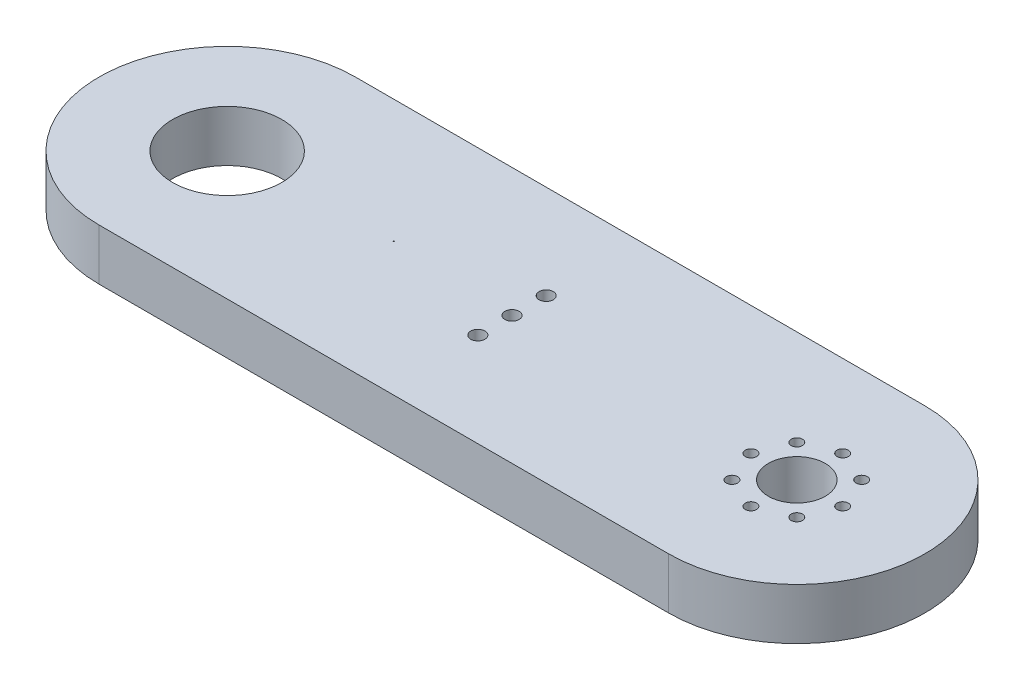
ISO-10303-21;
HEADER;
FILE_DESCRIPTION(('STEP AP214'),'2;1');
FILE_NAME('part.step','',(''),(''),'','','');
FILE_SCHEMA(('AUTOMOTIVE_DESIGN { 1 0 10303 214 1 1 1 1 }'));
ENDSEC;
DATA;
#1=APPLICATION_CONTEXT('core data for automotive mechanical design processes');
#2=APPLICATION_PROTOCOL_DEFINITION('international standard','automotive_design',2000,#1);
#3=PRODUCT_CONTEXT('',#1,'mechanical');
#4=PRODUCT('Part','Part','',(#3));
#5=PRODUCT_RELATED_PRODUCT_CATEGORY('part','',(#4));
#6=PRODUCT_DEFINITION_FORMATION('','',#4);
#7=PRODUCT_DEFINITION_CONTEXT('part definition',#1,'design');
#8=PRODUCT_DEFINITION('design','',#6,#7);
#9=PRODUCT_DEFINITION_SHAPE('','',#8);
#10=(LENGTH_UNIT() NAMED_UNIT(*) SI_UNIT(.MILLI.,.METRE.));
#11=(NAMED_UNIT(*) PLANE_ANGLE_UNIT() SI_UNIT($,.RADIAN.));
#12=(NAMED_UNIT(*) SI_UNIT($,.STERADIAN.) SOLID_ANGLE_UNIT());
#13=UNCERTAINTY_MEASURE_WITH_UNIT(LENGTH_MEASURE(1.E-05),#10,'distance_accuracy_value','');
#14=(GEOMETRIC_REPRESENTATION_CONTEXT(3) GLOBAL_UNCERTAINTY_ASSIGNED_CONTEXT((#13)) GLOBAL_UNIT_ASSIGNED_CONTEXT((#10,
#11,#12)) REPRESENTATION_CONTEXT('',''));
#15=CARTESIAN_POINT('',(0.,0.,0.));
#16=DIRECTION('',(0.,0.,1.));
#17=DIRECTION('',(1.,0.,0.));
#18=AXIS2_PLACEMENT_3D('',#15,#16,#17);
#19=CARTESIAN_POINT('',(50.,4.5,0.));
#20=DIRECTION('',(0.,-1.,0.));
#21=DIRECTION('',(0.,0.,-1.));
#22=AXIS2_PLACEMENT_3D('',#19,#20,#21);
#23=CYLINDRICAL_SURFACE('',#22,22.5);
#24=CARTESIAN_POINT('',(50.,-4.5,0.));
#25=DIRECTION('',(0.,1.,0.));
#26=DIRECTION('',(0.,0.,1.));
#27=AXIS2_PLACEMENT_3D('',#24,#25,#26);
#28=CIRCLE('',#27,22.5);
#29=CARTESIAN_POINT('',(50.,-4.5,22.5));
#30=VERTEX_POINT('',#29);
#31=CARTESIAN_POINT('',(50.,-4.5,-22.5));
#32=VERTEX_POINT('',#31);
#33=EDGE_CURVE('E107',#30,#32,#28,.T.);
#34=ORIENTED_EDGE('',*,*,#33,.T.);
#35=DIRECTION('',(0.,-1.,0.));
#36=VECTOR('',#35,1.);
#37=CARTESIAN_POINT('',(50.,4.5,-22.5));
#38=LINE('',#37,#36);
#39=CARTESIAN_POINT('',(50.,4.5,-22.5));
#40=VERTEX_POINT('',#39);
#41=EDGE_CURVE('E11',#40,#32,#38,.T.);
#42=ORIENTED_EDGE('',*,*,#41,.F.);
#43=CARTESIAN_POINT('',(50.,4.5,0.));
#44=DIRECTION('',(0.,1.,0.));
#45=DIRECTION('',(0.,0.,1.));
#46=AXIS2_PLACEMENT_3D('',#43,#44,#45);
#47=CIRCLE('',#46,22.5);
#48=CARTESIAN_POINT('',(50.,4.5,22.5));
#49=VERTEX_POINT('',#48);
#50=EDGE_CURVE('E91',#49,#40,#47,.T.);
#51=ORIENTED_EDGE('',*,*,#50,.F.);
#52=DIRECTION('',(0.,-1.,0.));
#53=VECTOR('',#52,1.);
#54=CARTESIAN_POINT('',(50.,4.5,22.5));
#55=LINE('',#54,#53);
#56=EDGE_CURVE('E103',#49,#30,#55,.T.);
#57=ORIENTED_EDGE('',*,*,#56,.T.);
#58=EDGE_LOOP('',(#34,#42,#51,#57));
#59=FACE_BOUND('',#58,.T.);
#60=ADVANCED_FACE('F39',(#59),#23,.T.);
#61=CARTESIAN_POINT('',(50.,4.5,-22.5));
#62=DIRECTION('',(0.,0.,1.));
#63=DIRECTION('',(1.,0.,0.));
#64=AXIS2_PLACEMENT_3D('',#61,#62,#63);
#65=PLANE('',#64);
#66=DIRECTION('',(-1.,0.,0.));
#67=VECTOR('',#66,1.);
#68=CARTESIAN_POINT('',(50.,-4.5,-22.5));
#69=LINE('',#68,#67);
#70=CARTESIAN_POINT('',(-50.,-4.5,-22.5));
#71=VERTEX_POINT('',#70);
#72=EDGE_CURVE('E96',#32,#71,#69,.T.);
#73=ORIENTED_EDGE('',*,*,#72,.T.);
#74=DIRECTION('',(0.,-1.,0.));
#75=VECTOR('',#74,1.);
#76=CARTESIAN_POINT('',(-50.,4.5,-22.5));
#77=LINE('',#76,#75);
#78=CARTESIAN_POINT('',(-50.,4.5,-22.5));
#79=VERTEX_POINT('',#78);
#80=EDGE_CURVE('E48',#79,#71,#77,.T.);
#81=ORIENTED_EDGE('',*,*,#80,.F.);
#82=DIRECTION('',(-1.,0.,0.));
#83=VECTOR('',#82,1.);
#84=CARTESIAN_POINT('',(50.,4.5,-22.5));
#85=LINE('',#84,#83);
#86=EDGE_CURVE('E86',#40,#79,#85,.T.);
#87=ORIENTED_EDGE('',*,*,#86,.F.);
#88=ORIENTED_EDGE('',*,*,#41,.T.);
#89=EDGE_LOOP('',(#73,#81,#87,#88));
#90=FACE_BOUND('',#89,.T.);
#91=ADVANCED_FACE('F95',(#90),#65,.F.);
#92=CARTESIAN_POINT('',(-50.,4.5,0.));
#93=DIRECTION('',(0.,-1.,0.));
#94=DIRECTION('',(0.,0.,-1.));
#95=AXIS2_PLACEMENT_3D('',#92,#93,#94);
#96=CYLINDRICAL_SURFACE('',#95,22.5);
#97=CARTESIAN_POINT('',(-50.,-4.5,0.));
#98=DIRECTION('',(0.,1.,0.));
#99=DIRECTION('',(0.,0.,1.));
#100=AXIS2_PLACEMENT_3D('',#97,#98,#99);
#101=CIRCLE('',#100,22.5);
#102=CARTESIAN_POINT('',(-50.,-4.5,22.5));
#103=VERTEX_POINT('',#102);
#104=EDGE_CURVE('E73',#71,#103,#101,.T.);
#105=ORIENTED_EDGE('',*,*,#104,.T.);
#106=DIRECTION('',(0.,-1.,0.));
#107=VECTOR('',#106,1.);
#108=CARTESIAN_POINT('',(-50.,4.5,22.5));
#109=LINE('',#108,#107);
#110=CARTESIAN_POINT('',(-50.,4.5,22.5));
#111=VERTEX_POINT('',#110);
#112=EDGE_CURVE('E98',#111,#103,#109,.T.);
#113=ORIENTED_EDGE('',*,*,#112,.F.);
#114=CARTESIAN_POINT('',(-50.,4.5,0.));
#115=DIRECTION('',(0.,1.,0.));
#116=DIRECTION('',(0.,0.,1.));
#117=AXIS2_PLACEMENT_3D('',#114,#115,#116);
#118=CIRCLE('',#117,22.5);
#119=EDGE_CURVE('E89',#79,#111,#118,.T.);
#120=ORIENTED_EDGE('',*,*,#119,.F.);
#121=ORIENTED_EDGE('',*,*,#80,.T.);
#122=EDGE_LOOP('',(#105,#113,#120,#121));
#123=FACE_BOUND('',#122,.T.);
#124=ADVANCED_FACE('F99',(#123),#96,.T.);
#125=CARTESIAN_POINT('',(50.,4.5,22.5));
#126=DIRECTION('',(0.,0.,-1.));
#127=DIRECTION('',(-1.,0.,0.));
#128=AXIS2_PLACEMENT_3D('',#125,#126,#127);
#129=PLANE('',#128);
#130=DIRECTION('',(1.,0.,0.));
#131=VECTOR('',#130,1.);
#132=CARTESIAN_POINT('',(50.,-4.5,22.5));
#133=LINE('',#132,#131);
#134=EDGE_CURVE('E79',#103,#30,#133,.T.);
#135=ORIENTED_EDGE('',*,*,#134,.T.);
#136=ORIENTED_EDGE('',*,*,#56,.F.);
#137=DIRECTION('',(1.,0.,0.));
#138=VECTOR('',#137,1.);
#139=CARTESIAN_POINT('',(50.,4.5,22.5));
#140=LINE('',#139,#138);
#141=EDGE_CURVE('E56',#111,#49,#140,.T.);
#142=ORIENTED_EDGE('',*,*,#141,.F.);
#143=ORIENTED_EDGE('',*,*,#112,.T.);
#144=EDGE_LOOP('',(#135,#136,#142,#143));
#145=FACE_BOUND('',#144,.T.);
#146=ADVANCED_FACE('F121',(#145),#129,.F.);
#147=CARTESIAN_POINT('',(50.,4.5,0.));
#148=DIRECTION('',(0.,1.,0.));
#149=DIRECTION('',(0.,0.,1.));
#150=AXIS2_PLACEMENT_3D('',#147,#148,#149);
#151=PLANE('',#150);
#152=CARTESIAN_POINT('',(-21.6659429639133,4.5,-0.906896610734044));
#153=DIRECTION('',(0.,-1.,0.));
#154=DIRECTION('',(0.,0.,-1.));
#155=AXIS2_PLACEMENT_3D('',#152,#153,#154);
#156=CIRCLE('',#155,0.0749299999999974);
#157=CARTESIAN_POINT('',(-21.6659429639133,4.5,-0.981826610734041));
#158=VERTEX_POINT('',#157);
#159=EDGE_CURVE('E231',#158,#158,#156,.T.);
#160=ORIENTED_EDGE('',*,*,#159,.T.);
#161=EDGE_LOOP('',(#160));
#162=FACE_BOUND('',#161,.T.);
#163=CARTESIAN_POINT('',(-50.,4.5,0.));
#164=DIRECTION('',(0.,1.,0.));
#165=DIRECTION('',(0.,0.,1.));
#166=AXIS2_PLACEMENT_3D('',#163,#164,#165);
#167=CIRCLE('',#166,9.59179886556777);
#168=CARTESIAN_POINT('',(-50.,4.5,9.59179886556778));
#169=VERTEX_POINT('',#168);
#170=EDGE_CURVE('E217',#169,#169,#167,.T.);
#171=ORIENTED_EDGE('',*,*,#170,.F.);
#172=EDGE_LOOP('',(#171));
#173=FACE_BOUND('',#172,.T.);
#174=CARTESIAN_POINT('',(0.,4.5,-6.00000000000156));
#175=DIRECTION('',(0.,1.,0.));
#176=DIRECTION('',(0.,0.,1.));
#177=AXIS2_PLACEMENT_3D('',#174,#175,#176);
#178=CIRCLE('',#177,1.24999999999954);
#179=CARTESIAN_POINT('',(0.,4.5,-4.75000000000202));
#180=VERTEX_POINT('',#179);
#181=EDGE_CURVE('E196',#180,#180,#178,.T.);
#182=ORIENTED_EDGE('',*,*,#181,.F.);
#183=EDGE_LOOP('',(#182));
#184=FACE_BOUND('',#183,.T.);
#185=CARTESIAN_POINT('',(0.,4.5,-1.04083408558608E-12));
#186=DIRECTION('',(0.,1.,0.));
#187=DIRECTION('',(0.,0.,1.));
#188=AXIS2_PLACEMENT_3D('',#185,#186,#187);
#189=CIRCLE('',#188,1.2499999999997);
#190=CARTESIAN_POINT('',(0.,4.5,1.24999999999865));
#191=VERTEX_POINT('',#190);
#192=EDGE_CURVE('E203',#191,#191,#189,.T.);
#193=ORIENTED_EDGE('',*,*,#192,.F.);
#194=EDGE_LOOP('',(#193));
#195=FACE_BOUND('',#194,.T.);
#196=CARTESIAN_POINT('',(0.,4.5,5.99999999999896));
#197=DIRECTION('',(0.,1.,0.));
#198=DIRECTION('',(0.,0.,1.));
#199=AXIS2_PLACEMENT_3D('',#196,#197,#198);
#200=CIRCLE('',#199,1.2499999999997);
#201=CARTESIAN_POINT('',(0.,4.5,7.24999999999866));
#202=VERTEX_POINT('',#201);
#203=EDGE_CURVE('E207',#202,#202,#200,.T.);
#204=ORIENTED_EDGE('',*,*,#203,.F.);
#205=EDGE_LOOP('',(#204));
#206=FACE_BOUND('',#205,.T.);
#207=CARTESIAN_POINT('',(50.,4.5,0.));
#208=DIRECTION('',(0.,1.,0.));
#209=DIRECTION('',(0.,0.,1.));
#210=AXIS2_PLACEMENT_3D('',#207,#208,#209);
#211=CIRCLE('',#210,5.);
#212=CARTESIAN_POINT('',(50.,4.5,4.99999999999998));
#213=VERTEX_POINT('',#212);
#214=EDGE_CURVE('E192',#213,#213,#211,.T.);
#215=ORIENTED_EDGE('',*,*,#214,.F.);
#216=EDGE_LOOP('',(#215));
#217=FACE_BOUND('',#216,.T.);
#218=CARTESIAN_POINT('',(41.95,4.5,0.));
#219=DIRECTION('',(0.,1.,0.));
#220=DIRECTION('',(0.,0.,1.));
#221=AXIS2_PLACEMENT_3D('',#218,#219,#220);
#222=CIRCLE('',#221,0.989999999999994);
#223=CARTESIAN_POINT('',(41.95,4.5,0.989999999999994));
#224=VERTEX_POINT('',#223);
#225=EDGE_CURVE('E111',#224,#224,#222,.T.);
#226=ORIENTED_EDGE('',*,*,#225,.F.);
#227=EDGE_LOOP('',(#226));
#228=FACE_BOUND('',#227,.T.);
#229=CARTESIAN_POINT('',(44.3077904114483,4.5,-5.69220958855171));
#230=DIRECTION('',(0.,1.,0.));
#231=DIRECTION('',(0.,0.,1.));
#232=AXIS2_PLACEMENT_3D('',#229,#230,#231);
#233=CIRCLE('',#232,0.989999999999994);
#234=CARTESIAN_POINT('',(44.3077904114483,4.5,-4.70220958855171));
#235=VERTEX_POINT('',#234);
#236=EDGE_CURVE('E131',#235,#235,#233,.T.);
#237=ORIENTED_EDGE('',*,*,#236,.F.);
#238=EDGE_LOOP('',(#237));
#239=FACE_BOUND('',#238,.T.);
#240=CARTESIAN_POINT('',(50.,4.5,-8.05));
#241=DIRECTION('',(0.,1.,0.));
#242=DIRECTION('',(0.,0.,1.));
#243=AXIS2_PLACEMENT_3D('',#240,#241,#242);
#244=CIRCLE('',#243,0.989999999999994);
#245=CARTESIAN_POINT('',(50.,4.5,-7.06000000000001));
#246=VERTEX_POINT('',#245);
#247=EDGE_CURVE('E135',#246,#246,#244,.T.);
#248=ORIENTED_EDGE('',*,*,#247,.F.);
#249=EDGE_LOOP('',(#248));
#250=FACE_BOUND('',#249,.T.);
#251=CARTESIAN_POINT('',(55.6922095885517,4.5,-5.69220958855171));
#252=DIRECTION('',(0.,1.,0.));
#253=DIRECTION('',(0.,0.,1.));
#254=AXIS2_PLACEMENT_3D('',#251,#252,#253);
#255=CIRCLE('',#254,0.989999999999994);
#256=CARTESIAN_POINT('',(55.6922095885517,4.5,-4.70220958855172));
#257=VERTEX_POINT('',#256);
#258=EDGE_CURVE('E139',#257,#257,#255,.T.);
#259=ORIENTED_EDGE('',*,*,#258,.F.);
#260=EDGE_LOOP('',(#259));
#261=FACE_BOUND('',#260,.T.);
#262=CARTESIAN_POINT('',(58.05,4.5,0.));
#263=DIRECTION('',(0.,1.,0.));
#264=DIRECTION('',(0.,0.,1.));
#265=AXIS2_PLACEMENT_3D('',#262,#263,#264);
#266=CIRCLE('',#265,0.989999999999994);
#267=CARTESIAN_POINT('',(58.05,4.5,0.989999999999991));
#268=VERTEX_POINT('',#267);
#269=EDGE_CURVE('E143',#268,#268,#266,.T.);
#270=ORIENTED_EDGE('',*,*,#269,.F.);
#271=EDGE_LOOP('',(#270));
#272=FACE_BOUND('',#271,.T.);
#273=CARTESIAN_POINT('',(55.6922095885517,4.5,5.69220958855171));
#274=DIRECTION('',(0.,1.,0.));
#275=DIRECTION('',(0.,0.,1.));
#276=AXIS2_PLACEMENT_3D('',#273,#274,#275);
#277=CIRCLE('',#276,0.990000000000001);
#278=CARTESIAN_POINT('',(55.6922095885517,4.5,6.68220958855171));
#279=VERTEX_POINT('',#278);
#280=EDGE_CURVE('E147',#279,#279,#277,.T.);
#281=ORIENTED_EDGE('',*,*,#280,.F.);
#282=EDGE_LOOP('',(#281));
#283=FACE_BOUND('',#282,.T.);
#284=CARTESIAN_POINT('',(50.,4.5,8.05));
#285=DIRECTION('',(0.,1.,0.));
#286=DIRECTION('',(0.,0.,1.));
#287=AXIS2_PLACEMENT_3D('',#284,#285,#286);
#288=CIRCLE('',#287,0.989999999999994);
#289=CARTESIAN_POINT('',(50.,4.5,9.04));
#290=VERTEX_POINT('',#289);
#291=EDGE_CURVE('E151',#290,#290,#288,.T.);
#292=ORIENTED_EDGE('',*,*,#291,.F.);
#293=EDGE_LOOP('',(#292));
#294=FACE_BOUND('',#293,.T.);
#295=CARTESIAN_POINT('',(44.3077904114483,4.5,5.69220958855171));
#296=DIRECTION('',(0.,1.,0.));
#297=DIRECTION('',(0.,0.,1.));
#298=AXIS2_PLACEMENT_3D('',#295,#296,#297);
#299=CIRCLE('',#298,0.989999999999994);
#300=CARTESIAN_POINT('',(44.3077904114483,4.5,6.6822095885517));
#301=VERTEX_POINT('',#300);
#302=EDGE_CURVE('E155',#301,#301,#299,.T.);
#303=ORIENTED_EDGE('',*,*,#302,.F.);
#304=EDGE_LOOP('',(#303));
#305=FACE_BOUND('',#304,.T.);
#306=ORIENTED_EDGE('',*,*,#50,.T.);
#307=ORIENTED_EDGE('',*,*,#86,.T.);
#308=ORIENTED_EDGE('',*,*,#119,.T.);
#309=ORIENTED_EDGE('',*,*,#141,.T.);
#310=EDGE_LOOP('',(#306,#307,#308,#309));
#311=FACE_BOUND('',#310,.T.);
#312=ADVANCED_FACE('F87',(#162,#173,#184,#195,#206,#217,#228,#239,#250,#261,#272,#283,#294,#305,
#311),#151,.T.);
#313=CARTESIAN_POINT('',(50.,-4.5,0.));
#314=DIRECTION('',(0.,1.,0.));
#315=DIRECTION('',(0.,0.,1.));
#316=AXIS2_PLACEMENT_3D('',#313,#314,#315);
#317=PLANE('',#316);
#318=CARTESIAN_POINT('',(-21.6659429639133,-4.5,-0.906896610734044));
#319=DIRECTION('',(0.,-1.,0.));
#320=DIRECTION('',(0.,0.,-1.));
#321=AXIS2_PLACEMENT_3D('',#318,#319,#320);
#322=CIRCLE('',#321,0.0749299999999974);
#323=CARTESIAN_POINT('',(-21.6659429639133,-4.5,-0.981826610734041));
#324=VERTEX_POINT('',#323);
#325=EDGE_CURVE('E235',#324,#324,#322,.T.);
#326=ORIENTED_EDGE('',*,*,#325,.F.);
#327=EDGE_LOOP('',(#326));
#328=FACE_BOUND('',#327,.T.);
#329=CARTESIAN_POINT('',(-50.,-4.5,0.));
#330=DIRECTION('',(0.,1.,0.));
#331=DIRECTION('',(0.,0.,1.));
#332=AXIS2_PLACEMENT_3D('',#329,#330,#331);
#333=CIRCLE('',#332,9.59179886556777);
#334=CARTESIAN_POINT('',(-50.,-4.5,9.59179886556778));
#335=VERTEX_POINT('',#334);
#336=EDGE_CURVE('E227',#335,#335,#333,.T.);
#337=ORIENTED_EDGE('',*,*,#336,.T.);
#338=EDGE_LOOP('',(#337));
#339=FACE_BOUND('',#338,.T.);
#340=CARTESIAN_POINT('',(0.,-4.5,-6.00000000000156));
#341=DIRECTION('',(0.,1.,0.));
#342=DIRECTION('',(0.,0.,1.));
#343=AXIS2_PLACEMENT_3D('',#340,#341,#342);
#344=CIRCLE('',#343,1.24999999999954);
#345=CARTESIAN_POINT('',(0.,-4.5,-4.75000000000202));
#346=VERTEX_POINT('',#345);
#347=EDGE_CURVE('E211',#346,#346,#344,.T.);
#348=ORIENTED_EDGE('',*,*,#347,.T.);
#349=EDGE_LOOP('',(#348));
#350=FACE_BOUND('',#349,.T.);
#351=CARTESIAN_POINT('',(0.,-4.5,-1.04083408558608E-12));
#352=DIRECTION('',(0.,1.,0.));
#353=DIRECTION('',(0.,0.,1.));
#354=AXIS2_PLACEMENT_3D('',#351,#352,#353);
#355=CIRCLE('',#354,1.2499999999997);
#356=CARTESIAN_POINT('',(0.,-4.5,1.24999999999865));
#357=VERTEX_POINT('',#356);
#358=EDGE_CURVE('E216',#357,#357,#355,.T.);
#359=ORIENTED_EDGE('',*,*,#358,.T.);
#360=EDGE_LOOP('',(#359));
#361=FACE_BOUND('',#360,.T.);
#362=CARTESIAN_POINT('',(0.,-4.5,5.99999999999896));
#363=DIRECTION('',(0.,1.,0.));
#364=DIRECTION('',(0.,0.,1.));
#365=AXIS2_PLACEMENT_3D('',#362,#363,#364);
#366=CIRCLE('',#365,1.2499999999997);
#367=CARTESIAN_POINT('',(0.,-4.5,7.24999999999866));
#368=VERTEX_POINT('',#367);
#369=EDGE_CURVE('E212',#368,#368,#366,.T.);
#370=ORIENTED_EDGE('',*,*,#369,.T.);
#371=EDGE_LOOP('',(#370));
#372=FACE_BOUND('',#371,.T.);
#373=CARTESIAN_POINT('',(50.,-4.5,0.));
#374=DIRECTION('',(0.,1.,0.));
#375=DIRECTION('',(0.,0.,1.));
#376=AXIS2_PLACEMENT_3D('',#373,#374,#375);
#377=CIRCLE('',#376,5.);
#378=CARTESIAN_POINT('',(50.,-4.5,4.99999999999998));
#379=VERTEX_POINT('',#378);
#380=EDGE_CURVE('E165',#379,#379,#377,.T.);
#381=ORIENTED_EDGE('',*,*,#380,.T.);
#382=EDGE_LOOP('',(#381));
#383=FACE_BOUND('',#382,.T.);
#384=CARTESIAN_POINT('',(41.95,-4.5,0.));
#385=DIRECTION('',(0.,1.,0.));
#386=DIRECTION('',(0.,0.,1.));
#387=AXIS2_PLACEMENT_3D('',#384,#385,#386);
#388=CIRCLE('',#387,0.989999999999994);
#389=CARTESIAN_POINT('',(41.95,-4.5,0.989999999999994));
#390=VERTEX_POINT('',#389);
#391=EDGE_CURVE('E159',#390,#390,#388,.T.);
#392=ORIENTED_EDGE('',*,*,#391,.T.);
#393=EDGE_LOOP('',(#392));
#394=FACE_BOUND('',#393,.T.);
#395=CARTESIAN_POINT('',(44.3077904114483,-4.5,-5.69220958855171));
#396=DIRECTION('',(0.,1.,0.));
#397=DIRECTION('',(0.,0.,1.));
#398=AXIS2_PLACEMENT_3D('',#395,#396,#397);
#399=CIRCLE('',#398,0.989999999999994);
#400=CARTESIAN_POINT('',(44.3077904114483,-4.5,-4.70220958855171));
#401=VERTEX_POINT('',#400);
#402=EDGE_CURVE('E185',#401,#401,#399,.T.);
#403=ORIENTED_EDGE('',*,*,#402,.T.);
#404=EDGE_LOOP('',(#403));
#405=FACE_BOUND('',#404,.T.);
#406=CARTESIAN_POINT('',(50.,-4.5,-8.05));
#407=DIRECTION('',(0.,1.,0.));
#408=DIRECTION('',(0.,0.,1.));
#409=AXIS2_PLACEMENT_3D('',#406,#407,#408);
#410=CIRCLE('',#409,0.989999999999994);
#411=CARTESIAN_POINT('',(50.,-4.5,-7.06000000000001));
#412=VERTEX_POINT('',#411);
#413=EDGE_CURVE('E181',#412,#412,#410,.T.);
#414=ORIENTED_EDGE('',*,*,#413,.T.);
#415=EDGE_LOOP('',(#414));
#416=FACE_BOUND('',#415,.T.);
#417=CARTESIAN_POINT('',(55.6922095885517,-4.5,-5.69220958855171));
#418=DIRECTION('',(0.,1.,0.));
#419=DIRECTION('',(0.,0.,1.));
#420=AXIS2_PLACEMENT_3D('',#417,#418,#419);
#421=CIRCLE('',#420,0.989999999999994);
#422=CARTESIAN_POINT('',(55.6922095885517,-4.5,-4.70220958855172));
#423=VERTEX_POINT('',#422);
#424=EDGE_CURVE('E177',#423,#423,#421,.T.);
#425=ORIENTED_EDGE('',*,*,#424,.T.);
#426=EDGE_LOOP('',(#425));
#427=FACE_BOUND('',#426,.T.);
#428=CARTESIAN_POINT('',(58.05,-4.5,0.));
#429=DIRECTION('',(0.,1.,0.));
#430=DIRECTION('',(0.,0.,1.));
#431=AXIS2_PLACEMENT_3D('',#428,#429,#430);
#432=CIRCLE('',#431,0.989999999999994);
#433=CARTESIAN_POINT('',(58.05,-4.5,0.989999999999991));
#434=VERTEX_POINT('',#433);
#435=EDGE_CURVE('E173',#434,#434,#432,.T.);
#436=ORIENTED_EDGE('',*,*,#435,.T.);
#437=EDGE_LOOP('',(#436));
#438=FACE_BOUND('',#437,.T.);
#439=CARTESIAN_POINT('',(55.6922095885517,-4.5,5.69220958855171));
#440=DIRECTION('',(0.,1.,0.));
#441=DIRECTION('',(0.,0.,1.));
#442=AXIS2_PLACEMENT_3D('',#439,#440,#441);
#443=CIRCLE('',#442,0.990000000000001);
#444=CARTESIAN_POINT('',(55.6922095885517,-4.5,6.68220958855171));
#445=VERTEX_POINT('',#444);
#446=EDGE_CURVE('E169',#445,#445,#443,.T.);
#447=ORIENTED_EDGE('',*,*,#446,.T.);
#448=EDGE_LOOP('',(#447));
#449=FACE_BOUND('',#448,.T.);
#450=CARTESIAN_POINT('',(50.,-4.5,8.05));
#451=DIRECTION('',(0.,1.,0.));
#452=DIRECTION('',(0.,0.,1.));
#453=AXIS2_PLACEMENT_3D('',#450,#451,#452);
#454=CIRCLE('',#453,0.989999999999994);
#455=CARTESIAN_POINT('',(50.,-4.5,9.04));
#456=VERTEX_POINT('',#455);
#457=EDGE_CURVE('E164',#456,#456,#454,.T.);
#458=ORIENTED_EDGE('',*,*,#457,.T.);
#459=EDGE_LOOP('',(#458));
#460=FACE_BOUND('',#459,.T.);
#461=CARTESIAN_POINT('',(44.3077904114483,-4.5,5.69220958855171));
#462=DIRECTION('',(0.,1.,0.));
#463=DIRECTION('',(0.,0.,1.));
#464=AXIS2_PLACEMENT_3D('',#461,#462,#463);
#465=CIRCLE('',#464,0.989999999999994);
#466=CARTESIAN_POINT('',(44.3077904114483,-4.5,6.6822095885517));
#467=VERTEX_POINT('',#466);
#468=EDGE_CURVE('E160',#467,#467,#465,.T.);
#469=ORIENTED_EDGE('',*,*,#468,.T.);
#470=EDGE_LOOP('',(#469));
#471=FACE_BOUND('',#470,.T.);
#472=ORIENTED_EDGE('',*,*,#33,.F.);
#473=ORIENTED_EDGE('',*,*,#134,.F.);
#474=ORIENTED_EDGE('',*,*,#104,.F.);
#475=ORIENTED_EDGE('',*,*,#72,.F.);
#476=EDGE_LOOP('',(#472,#473,#474,#475));
#477=FACE_BOUND('',#476,.T.);
#478=ADVANCED_FACE('F124',(#328,#339,#350,#361,#372,#383,#394,#405,#416,#427,#438,#449,#460,
#471,#477),#317,.F.);
#479=CARTESIAN_POINT('',(44.3077904114483,-4.5,5.69220958855171));
#480=DIRECTION('',(0.,1.,0.));
#481=DIRECTION('',(0.,0.,1.));
#482=AXIS2_PLACEMENT_3D('',#479,#480,#481);
#483=CYLINDRICAL_SURFACE('',#482,0.989999999999994);
#484=ORIENTED_EDGE('',*,*,#302,.T.);
#485=EDGE_LOOP('',(#484));
#486=FACE_BOUND('',#485,.T.);
#487=ORIENTED_EDGE('',*,*,#468,.F.);
#488=EDGE_LOOP('',(#487));
#489=FACE_BOUND('',#488,.T.);
#490=ADVANCED_FACE('F244',(#486,#489),#483,.F.);
#491=CARTESIAN_POINT('',(50.,-4.5,8.05));
#492=DIRECTION('',(0.,1.,0.));
#493=DIRECTION('',(0.,0.,1.));
#494=AXIS2_PLACEMENT_3D('',#491,#492,#493);
#495=CYLINDRICAL_SURFACE('',#494,0.989999999999994);
#496=ORIENTED_EDGE('',*,*,#291,.T.);
#497=EDGE_LOOP('',(#496));
#498=FACE_BOUND('',#497,.T.);
#499=ORIENTED_EDGE('',*,*,#457,.F.);
#500=EDGE_LOOP('',(#499));
#501=FACE_BOUND('',#500,.T.);
#502=ADVANCED_FACE('F273',(#498,#501),#495,.F.);
#503=CARTESIAN_POINT('',(55.6922095885517,-4.5,5.69220958855171));
#504=DIRECTION('',(0.,1.,0.));
#505=DIRECTION('',(0.,0.,1.));
#506=AXIS2_PLACEMENT_3D('',#503,#504,#505);
#507=CYLINDRICAL_SURFACE('',#506,0.990000000000001);
#508=ORIENTED_EDGE('',*,*,#280,.T.);
#509=EDGE_LOOP('',(#508));
#510=FACE_BOUND('',#509,.T.);
#511=ORIENTED_EDGE('',*,*,#446,.F.);
#512=EDGE_LOOP('',(#511));
#513=FACE_BOUND('',#512,.T.);
#514=ADVANCED_FACE('F279',(#510,#513),#507,.F.);
#515=CARTESIAN_POINT('',(58.05,-4.5,0.));
#516=DIRECTION('',(0.,1.,0.));
#517=DIRECTION('',(0.,0.,1.));
#518=AXIS2_PLACEMENT_3D('',#515,#516,#517);
#519=CYLINDRICAL_SURFACE('',#518,0.989999999999994);
#520=ORIENTED_EDGE('',*,*,#269,.T.);
#521=EDGE_LOOP('',(#520));
#522=FACE_BOUND('',#521,.T.);
#523=ORIENTED_EDGE('',*,*,#435,.F.);
#524=EDGE_LOOP('',(#523));
#525=FACE_BOUND('',#524,.T.);
#526=ADVANCED_FACE('F328',(#522,#525),#519,.F.);
#527=CARTESIAN_POINT('',(55.6922095885517,-4.5,-5.69220958855171));
#528=DIRECTION('',(0.,1.,0.));
#529=DIRECTION('',(0.,0.,1.));
#530=AXIS2_PLACEMENT_3D('',#527,#528,#529);
#531=CYLINDRICAL_SURFACE('',#530,0.989999999999994);
#532=ORIENTED_EDGE('',*,*,#258,.T.);
#533=EDGE_LOOP('',(#532));
#534=FACE_BOUND('',#533,.T.);
#535=ORIENTED_EDGE('',*,*,#424,.F.);
#536=EDGE_LOOP('',(#535));
#537=FACE_BOUND('',#536,.T.);
#538=ADVANCED_FACE('F333',(#534,#537),#531,.F.);
#539=CARTESIAN_POINT('',(50.,-4.5,-8.05));
#540=DIRECTION('',(0.,1.,0.));
#541=DIRECTION('',(0.,0.,1.));
#542=AXIS2_PLACEMENT_3D('',#539,#540,#541);
#543=CYLINDRICAL_SURFACE('',#542,0.989999999999994);
#544=ORIENTED_EDGE('',*,*,#247,.T.);
#545=EDGE_LOOP('',(#544));
#546=FACE_BOUND('',#545,.T.);
#547=ORIENTED_EDGE('',*,*,#413,.F.);
#548=EDGE_LOOP('',(#547));
#549=FACE_BOUND('',#548,.T.);
#550=ADVANCED_FACE('F339',(#546,#549),#543,.F.);
#551=CARTESIAN_POINT('',(44.3077904114483,-4.5,-5.69220958855171));
#552=DIRECTION('',(0.,1.,0.));
#553=DIRECTION('',(0.,0.,1.));
#554=AXIS2_PLACEMENT_3D('',#551,#552,#553);
#555=CYLINDRICAL_SURFACE('',#554,0.989999999999994);
#556=ORIENTED_EDGE('',*,*,#236,.T.);
#557=EDGE_LOOP('',(#556));
#558=FACE_BOUND('',#557,.T.);
#559=ORIENTED_EDGE('',*,*,#402,.F.);
#560=EDGE_LOOP('',(#559));
#561=FACE_BOUND('',#560,.T.);
#562=ADVANCED_FACE('F343',(#558,#561),#555,.F.);
#563=CARTESIAN_POINT('',(41.95,-4.5,0.));
#564=DIRECTION('',(0.,1.,0.));
#565=DIRECTION('',(0.,0.,1.));
#566=AXIS2_PLACEMENT_3D('',#563,#564,#565);
#567=CYLINDRICAL_SURFACE('',#566,0.989999999999994);
#568=ORIENTED_EDGE('',*,*,#225,.T.);
#569=EDGE_LOOP('',(#568));
#570=FACE_BOUND('',#569,.T.);
#571=ORIENTED_EDGE('',*,*,#391,.F.);
#572=EDGE_LOOP('',(#571));
#573=FACE_BOUND('',#572,.T.);
#574=ADVANCED_FACE('F347',(#570,#573),#567,.F.);
#575=CARTESIAN_POINT('',(50.,-4.5,0.));
#576=DIRECTION('',(0.,1.,0.));
#577=DIRECTION('',(0.,0.,1.));
#578=AXIS2_PLACEMENT_3D('',#575,#576,#577);
#579=CYLINDRICAL_SURFACE('',#578,5.);
#580=ORIENTED_EDGE('',*,*,#380,.F.);
#581=EDGE_LOOP('',(#580));
#582=FACE_BOUND('',#581,.T.);
#583=ORIENTED_EDGE('',*,*,#214,.T.);
#584=EDGE_LOOP('',(#583));
#585=FACE_BOUND('',#584,.T.);
#586=ADVANCED_FACE('F351',(#582,#585),#579,.F.);
#587=CARTESIAN_POINT('',(0.,-4.5,5.99999999999896));
#588=DIRECTION('',(0.,1.,0.));
#589=DIRECTION('',(0.,0.,1.));
#590=AXIS2_PLACEMENT_3D('',#587,#588,#589);
#591=CYLINDRICAL_SURFACE('',#590,1.2499999999997);
#592=ORIENTED_EDGE('',*,*,#203,.T.);
#593=EDGE_LOOP('',(#592));
#594=FACE_BOUND('',#593,.T.);
#595=ORIENTED_EDGE('',*,*,#369,.F.);
#596=EDGE_LOOP('',(#595));
#597=FACE_BOUND('',#596,.T.);
#598=ADVANCED_FACE('F355',(#594,#597),#591,.F.);
#599=CARTESIAN_POINT('',(0.,-4.5,-1.04083408558608E-12));
#600=DIRECTION('',(0.,1.,0.));
#601=DIRECTION('',(0.,0.,1.));
#602=AXIS2_PLACEMENT_3D('',#599,#600,#601);
#603=CYLINDRICAL_SURFACE('',#602,1.2499999999997);
#604=ORIENTED_EDGE('',*,*,#192,.T.);
#605=EDGE_LOOP('',(#604));
#606=FACE_BOUND('',#605,.T.);
#607=ORIENTED_EDGE('',*,*,#358,.F.);
#608=EDGE_LOOP('',(#607));
#609=FACE_BOUND('',#608,.T.);
#610=ADVANCED_FACE('F359',(#606,#609),#603,.F.);
#611=CARTESIAN_POINT('',(0.,-4.5,-6.00000000000156));
#612=DIRECTION('',(0.,1.,0.));
#613=DIRECTION('',(0.,0.,1.));
#614=AXIS2_PLACEMENT_3D('',#611,#612,#613);
#615=CYLINDRICAL_SURFACE('',#614,1.24999999999954);
#616=ORIENTED_EDGE('',*,*,#181,.T.);
#617=EDGE_LOOP('',(#616));
#618=FACE_BOUND('',#617,.T.);
#619=ORIENTED_EDGE('',*,*,#347,.F.);
#620=EDGE_LOOP('',(#619));
#621=FACE_BOUND('',#620,.T.);
#622=ADVANCED_FACE('F363',(#618,#621),#615,.F.);
#623=CARTESIAN_POINT('',(-50.,-4.5,0.));
#624=DIRECTION('',(0.,1.,0.));
#625=DIRECTION('',(0.,0.,1.));
#626=AXIS2_PLACEMENT_3D('',#623,#624,#625);
#627=CYLINDRICAL_SURFACE('',#626,9.59179886556777);
#628=ORIENTED_EDGE('',*,*,#170,.T.);
#629=EDGE_LOOP('',(#628));
#630=FACE_BOUND('',#629,.T.);
#631=ORIENTED_EDGE('',*,*,#336,.F.);
#632=EDGE_LOOP('',(#631));
#633=FACE_BOUND('',#632,.T.);
#634=ADVANCED_FACE('F367',(#630,#633),#627,.F.);
#635=CARTESIAN_POINT('',(-21.6659429639133,-4.5,-0.906896610734044));
#636=DIRECTION('',(0.,-1.,0.));
#637=DIRECTION('',(0.,0.,-1.));
#638=AXIS2_PLACEMENT_3D('',#635,#636,#637);
#639=CYLINDRICAL_SURFACE('',#638,0.0749299999999974);
#640=ORIENTED_EDGE('',*,*,#159,.F.);
#641=EDGE_LOOP('',(#640));
#642=FACE_BOUND('',#641,.T.);
#643=ORIENTED_EDGE('',*,*,#325,.T.);
#644=EDGE_LOOP('',(#643));
#645=FACE_BOUND('',#644,.T.);
#646=ADVANCED_FACE('F240',(#642,#645),#639,.F.);
#647=CLOSED_SHELL('',(#60,#91,#124,#146,#312,#478,#490,#502,#514,#526,#538,#550,#562,#574,#586,
#598,#610,#622,#634,#646));
#648=MANIFOLD_SOLID_BREP('B2',#647);
#649=ADVANCED_BREP_SHAPE_REPRESENTATION('',(#18,#648),#14);
#650=SHAPE_DEFINITION_REPRESENTATION(#9,#649);
ENDSEC;
END-ISO-10303-21;
